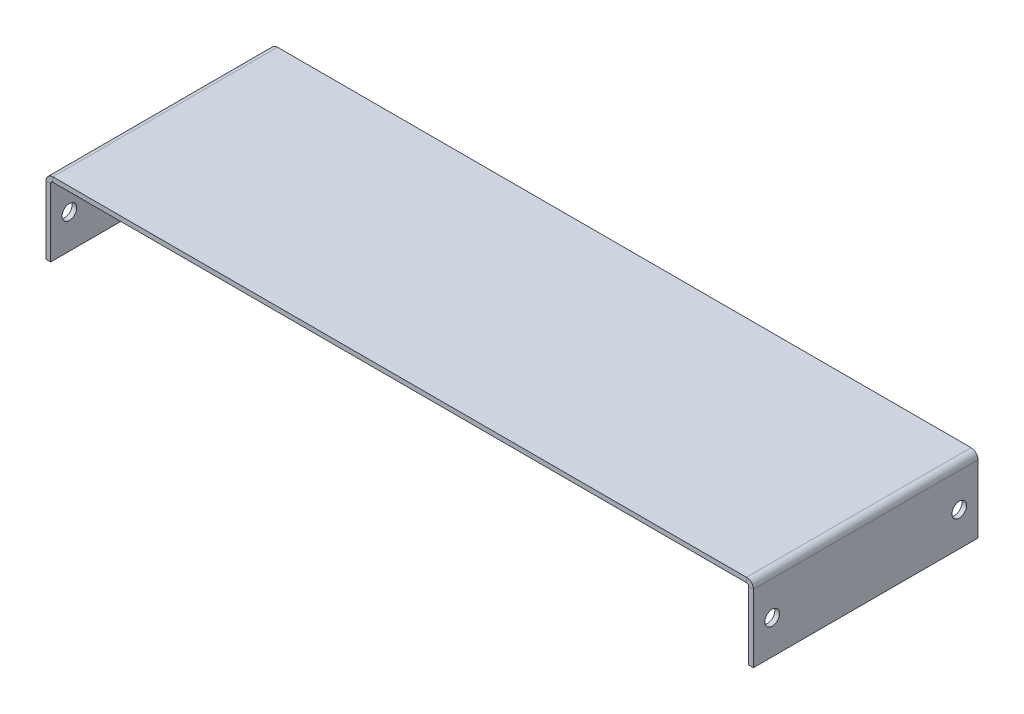
ISO-10303-21;
HEADER;
FILE_DESCRIPTION(('STEP AP214'),'2;1');
FILE_NAME('part.step','',(''),(''),'','','');
FILE_SCHEMA(('AUTOMOTIVE_DESIGN { 1 0 10303 214 1 1 1 1 }'));
ENDSEC;
DATA;
#1=APPLICATION_CONTEXT('core data for automotive mechanical design processes');
#2=APPLICATION_PROTOCOL_DEFINITION('international standard','automotive_design',2000,#1);
#3=PRODUCT_CONTEXT('',#1,'mechanical');
#4=PRODUCT('Part','Part','',(#3));
#5=PRODUCT_RELATED_PRODUCT_CATEGORY('part','',(#4));
#6=PRODUCT_DEFINITION_FORMATION('','',#4);
#7=PRODUCT_DEFINITION_CONTEXT('part definition',#1,'design');
#8=PRODUCT_DEFINITION('design','',#6,#7);
#9=PRODUCT_DEFINITION_SHAPE('','',#8);
#10=(LENGTH_UNIT() NAMED_UNIT(*) SI_UNIT(.MILLI.,.METRE.));
#11=(NAMED_UNIT(*) PLANE_ANGLE_UNIT() SI_UNIT($,.RADIAN.));
#12=(NAMED_UNIT(*) SI_UNIT($,.STERADIAN.) SOLID_ANGLE_UNIT());
#13=UNCERTAINTY_MEASURE_WITH_UNIT(LENGTH_MEASURE(1.E-05),#10,'distance_accuracy_value','');
#14=(GEOMETRIC_REPRESENTATION_CONTEXT(3) GLOBAL_UNCERTAINTY_ASSIGNED_CONTEXT((#13)) GLOBAL_UNIT_ASSIGNED_CONTEXT((#10,
#11,#12)) REPRESENTATION_CONTEXT('',''));
#15=CARTESIAN_POINT('',(0.,0.,0.));
#16=DIRECTION('',(0.,0.,1.));
#17=DIRECTION('',(1.,0.,0.));
#18=AXIS2_PLACEMENT_3D('',#15,#16,#17);
#19=CARTESIAN_POINT('',(-117.6655,25.4,38.1));
#20=DIRECTION('',(0.,0.,1.));
#21=DIRECTION('',(1.,0.,0.));
#22=AXIS2_PLACEMENT_3D('',#19,#20,#21);
#23=PLANE('',#22);
#24=DIRECTION('',(0.,-1.,0.));
#25=VECTOR('',#24,1.);
#26=CARTESIAN_POINT('',(-117.6655,25.4,38.1));
#27=LINE('',#26,#25);
#28=CARTESIAN_POINT('',(-117.6655,25.4,38.1));
#29=VERTEX_POINT('',#28);
#30=CARTESIAN_POINT('',(-117.6655,23.8125,38.1));
#31=VERTEX_POINT('',#30);
#32=EDGE_CURVE('E11',#29,#31,#27,.T.);
#33=ORIENTED_EDGE('',*,*,#32,.F.);
#34=CARTESIAN_POINT('',(-117.6655,23.0505,38.1));
#35=DIRECTION('',(0.,0.,1.));
#36=DIRECTION('',(1.,0.,0.));
#37=AXIS2_PLACEMENT_3D('',#34,#35,#36);
#38=CIRCLE('',#37,2.3495);
#39=CARTESIAN_POINT('',(-120.015,23.0505,38.1));
#40=VERTEX_POINT('',#39);
#41=EDGE_CURVE('E330',#40,#29,#38,.F.);
#42=ORIENTED_EDGE('',*,*,#41,.F.);
#43=DIRECTION('',(-1.,0.,0.));
#44=VECTOR('',#43,1.);
#45=CARTESIAN_POINT('',(-118.4275,23.0505,38.1));
#46=LINE('',#45,#44);
#47=CARTESIAN_POINT('',(-118.4275,23.0505,38.1));
#48=VERTEX_POINT('',#47);
#49=EDGE_CURVE('E57',#48,#40,#46,.T.);
#50=ORIENTED_EDGE('',*,*,#49,.F.);
#51=CARTESIAN_POINT('',(-117.6655,23.0505,38.1));
#52=DIRECTION('',(0.,0.,1.));
#53=DIRECTION('',(1.,0.,0.));
#54=AXIS2_PLACEMENT_3D('',#51,#52,#53);
#55=CIRCLE('',#54,0.762);
#56=EDGE_CURVE('E159',#48,#31,#55,.F.);
#57=ORIENTED_EDGE('',*,*,#56,.T.);
#58=EDGE_LOOP('',(#33,#42,#50,#57));
#59=FACE_BOUND('',#58,.T.);
#60=ADVANCED_FACE('F47',(#59),#23,.T.);
#61=CARTESIAN_POINT('',(-118.4275,23.0505,38.1));
#62=DIRECTION('',(0.,0.,1.));
#63=DIRECTION('',(1.,0.,0.));
#64=AXIS2_PLACEMENT_3D('',#61,#62,#63);
#65=PLANE('',#64);
#66=DIRECTION('',(1.,0.,0.));
#67=VECTOR('',#66,1.);
#68=CARTESIAN_POINT('',(-120.015,25.4,38.1));
#69=LINE('',#68,#67);
#70=CARTESIAN_POINT('',(117.6655,25.4,38.1));
#71=VERTEX_POINT('',#70);
#72=EDGE_CURVE('E153',#29,#71,#69,.T.);
#73=ORIENTED_EDGE('',*,*,#72,.F.);
#74=ORIENTED_EDGE('',*,*,#32,.T.);
#75=DIRECTION('',(1.,0.,0.));
#76=VECTOR('',#75,1.);
#77=CARTESIAN_POINT('',(-120.015,23.8125,38.1));
#78=LINE('',#77,#76);
#79=CARTESIAN_POINT('',(117.6655,23.8125,38.1));
#80=VERTEX_POINT('',#79);
#81=EDGE_CURVE('E150',#31,#80,#78,.T.);
#82=ORIENTED_EDGE('',*,*,#81,.T.);
#83=DIRECTION('',(0.,1.,0.));
#84=VECTOR('',#83,1.);
#85=CARTESIAN_POINT('',(117.6655,23.8125,38.1));
#86=LINE('',#85,#84);
#87=EDGE_CURVE('E271',#80,#71,#86,.T.);
#88=ORIENTED_EDGE('',*,*,#87,.T.);
#89=EDGE_LOOP('',(#73,#74,#82,#88));
#90=FACE_BOUND('',#89,.T.);
#91=ADVANCED_FACE('F148',(#90),#65,.T.);
#92=CARTESIAN_POINT('',(-120.015,23.0505,-38.1));
#93=DIRECTION('',(0.,0.,-1.));
#94=DIRECTION('',(-1.,0.,0.));
#95=AXIS2_PLACEMENT_3D('',#92,#93,#94);
#96=PLANE('',#95);
#97=DIRECTION('',(1.,0.,0.));
#98=VECTOR('',#97,1.);
#99=CARTESIAN_POINT('',(-120.015,23.0505,-38.1));
#100=LINE('',#99,#98);
#101=CARTESIAN_POINT('',(-120.015,23.0505,-38.1));
#102=VERTEX_POINT('',#101);
#103=CARTESIAN_POINT('',(-118.4275,23.0505,-38.1));
#104=VERTEX_POINT('',#103);
#105=EDGE_CURVE('E279',#102,#104,#100,.T.);
#106=ORIENTED_EDGE('',*,*,#105,.F.);
#107=CARTESIAN_POINT('',(-117.6655,23.0505,-38.1));
#108=DIRECTION('',(0.,0.,1.));
#109=DIRECTION('',(1.,0.,0.));
#110=AXIS2_PLACEMENT_3D('',#107,#108,#109);
#111=CIRCLE('',#110,2.3495);
#112=CARTESIAN_POINT('',(-117.6655,25.4,-38.1));
#113=VERTEX_POINT('',#112);
#114=EDGE_CURVE('E208',#102,#113,#111,.F.);
#115=ORIENTED_EDGE('',*,*,#114,.T.);
#116=DIRECTION('',(0.,1.,0.));
#117=VECTOR('',#116,1.);
#118=CARTESIAN_POINT('',(-117.6655,23.8125,-38.1));
#119=LINE('',#118,#117);
#120=CARTESIAN_POINT('',(-117.6655,23.8125,-38.1));
#121=VERTEX_POINT('',#120);
#122=EDGE_CURVE('E276',#121,#113,#119,.T.);
#123=ORIENTED_EDGE('',*,*,#122,.F.);
#124=CARTESIAN_POINT('',(-117.6655,23.0505,-38.1));
#125=DIRECTION('',(0.,0.,1.));
#126=DIRECTION('',(1.,0.,0.));
#127=AXIS2_PLACEMENT_3D('',#124,#125,#126);
#128=CIRCLE('',#127,0.762);
#129=EDGE_CURVE('E172',#104,#121,#128,.F.);
#130=ORIENTED_EDGE('',*,*,#129,.F.);
#131=EDGE_LOOP('',(#106,#115,#123,#130));
#132=FACE_BOUND('',#131,.T.);
#133=ADVANCED_FACE('F352',(#132),#96,.T.);
#134=CARTESIAN_POINT('',(-117.6655,23.8125,-38.1));
#135=DIRECTION('',(0.,0.,-1.));
#136=DIRECTION('',(-1.,0.,0.));
#137=AXIS2_PLACEMENT_3D('',#134,#135,#136);
#138=PLANE('',#137);
#139=DIRECTION('',(0.,1.,0.));
#140=VECTOR('',#139,1.);
#141=CARTESIAN_POINT('',(-120.015,0.,-38.1));
#142=LINE('',#141,#140);
#143=CARTESIAN_POINT('',(-120.015,0.,-38.1));
#144=VERTEX_POINT('',#143);
#145=EDGE_CURVE('E212',#144,#102,#142,.T.);
#146=ORIENTED_EDGE('',*,*,#145,.T.);
#147=ORIENTED_EDGE('',*,*,#105,.T.);
#148=DIRECTION('',(0.,1.,0.));
#149=VECTOR('',#148,1.);
#150=CARTESIAN_POINT('',(-118.4275,0.,-38.1));
#151=LINE('',#150,#149);
#152=CARTESIAN_POINT('',(-118.4275,0.,-38.1));
#153=VERTEX_POINT('',#152);
#154=EDGE_CURVE('E220',#153,#104,#151,.T.);
#155=ORIENTED_EDGE('',*,*,#154,.F.);
#156=DIRECTION('',(-1.,0.,0.));
#157=VECTOR('',#156,1.);
#158=CARTESIAN_POINT('',(-118.4275,0.,-38.1));
#159=LINE('',#158,#157);
#160=EDGE_CURVE('E216',#153,#144,#159,.T.);
#161=ORIENTED_EDGE('',*,*,#160,.T.);
#162=EDGE_LOOP('',(#146,#147,#155,#161));
#163=FACE_BOUND('',#162,.T.);
#164=ADVANCED_FACE('F400',(#163),#138,.T.);
#165=CARTESIAN_POINT('',(120.015,23.0505,38.1));
#166=DIRECTION('',(0.,0.,1.));
#167=DIRECTION('',(1.,0.,0.));
#168=AXIS2_PLACEMENT_3D('',#165,#166,#167);
#169=PLANE('',#168);
#170=DIRECTION('',(-1.,0.,0.));
#171=VECTOR('',#170,1.);
#172=CARTESIAN_POINT('',(120.015,23.0505,38.1));
#173=LINE('',#172,#171);
#174=CARTESIAN_POINT('',(120.015,23.0505,38.1));
#175=VERTEX_POINT('',#174);
#176=CARTESIAN_POINT('',(118.4275,23.0505,38.1));
#177=VERTEX_POINT('',#176);
#178=EDGE_CURVE('E66',#175,#177,#173,.T.);
#179=ORIENTED_EDGE('',*,*,#178,.F.);
#180=CARTESIAN_POINT('',(117.6655,23.0505,38.1));
#181=DIRECTION('',(0.,0.,1.));
#182=DIRECTION('',(1.,0.,0.));
#183=AXIS2_PLACEMENT_3D('',#180,#181,#182);
#184=CIRCLE('',#183,2.3495);
#185=EDGE_CURVE('E324',#71,#175,#184,.F.);
#186=ORIENTED_EDGE('',*,*,#185,.F.);
#187=ORIENTED_EDGE('',*,*,#87,.F.);
#188=CARTESIAN_POINT('',(117.6655,23.0505,38.1));
#189=DIRECTION('',(0.,0.,1.));
#190=DIRECTION('',(1.,0.,0.));
#191=AXIS2_PLACEMENT_3D('',#188,#189,#190);
#192=CIRCLE('',#191,0.762);
#193=EDGE_CURVE('E182',#80,#177,#192,.F.);
#194=ORIENTED_EDGE('',*,*,#193,.T.);
#195=EDGE_LOOP('',(#179,#186,#187,#194));
#196=FACE_BOUND('',#195,.T.);
#197=ADVANCED_FACE('F405',(#196),#169,.T.);
#198=CARTESIAN_POINT('',(117.6655,23.8125,38.1));
#199=DIRECTION('',(0.,0.,1.));
#200=DIRECTION('',(1.,0.,0.));
#201=AXIS2_PLACEMENT_3D('',#198,#199,#200);
#202=PLANE('',#201);
#203=DIRECTION('',(0.,-1.,0.));
#204=VECTOR('',#203,1.);
#205=CARTESIAN_POINT('',(120.015,25.4,38.1));
#206=LINE('',#205,#204);
#207=CARTESIAN_POINT('',(120.015,0.,38.1));
#208=VERTEX_POINT('',#207);
#209=EDGE_CURVE('E320',#175,#208,#206,.T.);
#210=ORIENTED_EDGE('',*,*,#209,.F.);
#211=ORIENTED_EDGE('',*,*,#178,.T.);
#212=DIRECTION('',(0.,1.,0.));
#213=VECTOR('',#212,1.);
#214=CARTESIAN_POINT('',(118.4275,25.4,38.1));
#215=LINE('',#214,#213);
#216=CARTESIAN_POINT('',(118.4275,0.,38.1));
#217=VERTEX_POINT('',#216);
#218=EDGE_CURVE('E120',#177,#217,#215,.F.);
#219=ORIENTED_EDGE('',*,*,#218,.T.);
#220=DIRECTION('',(-1.,0.,0.));
#221=VECTOR('',#220,1.);
#222=CARTESIAN_POINT('',(120.015,0.,38.1));
#223=LINE('',#222,#221);
#224=EDGE_CURVE('E316',#208,#217,#223,.T.);
#225=ORIENTED_EDGE('',*,*,#224,.F.);
#226=EDGE_LOOP('',(#210,#211,#219,#225));
#227=FACE_BOUND('',#226,.T.);
#228=ADVANCED_FACE('F379',(#227),#202,.T.);
#229=CARTESIAN_POINT('',(117.6655,25.4,-38.1));
#230=DIRECTION('',(0.,0.,-1.));
#231=DIRECTION('',(-1.,0.,0.));
#232=AXIS2_PLACEMENT_3D('',#229,#230,#231);
#233=PLANE('',#232);
#234=DIRECTION('',(0.,-1.,0.));
#235=VECTOR('',#234,1.);
#236=CARTESIAN_POINT('',(117.6655,25.4,-38.1));
#237=LINE('',#236,#235);
#238=CARTESIAN_POINT('',(117.6655,25.4,-38.1));
#239=VERTEX_POINT('',#238);
#240=CARTESIAN_POINT('',(117.6655,23.8125,-38.1));
#241=VERTEX_POINT('',#240);
#242=EDGE_CURVE('E107',#239,#241,#237,.T.);
#243=ORIENTED_EDGE('',*,*,#242,.F.);
#244=CARTESIAN_POINT('',(117.6655,23.0505,-38.1));
#245=DIRECTION('',(0.,0.,1.));
#246=DIRECTION('',(1.,0.,0.));
#247=AXIS2_PLACEMENT_3D('',#244,#245,#246);
#248=CIRCLE('',#247,2.3495);
#249=CARTESIAN_POINT('',(120.015,23.0505,-38.1));
#250=VERTEX_POINT('',#249);
#251=EDGE_CURVE('E202',#239,#250,#248,.F.);
#252=ORIENTED_EDGE('',*,*,#251,.T.);
#253=DIRECTION('',(1.,0.,0.));
#254=VECTOR('',#253,1.);
#255=CARTESIAN_POINT('',(118.4275,23.0505,-38.1));
#256=LINE('',#255,#254);
#257=CARTESIAN_POINT('',(118.4275,23.0505,-38.1));
#258=VERTEX_POINT('',#257);
#259=EDGE_CURVE('E114',#258,#250,#256,.T.);
#260=ORIENTED_EDGE('',*,*,#259,.F.);
#261=CARTESIAN_POINT('',(117.6655,23.0505,-38.1));
#262=DIRECTION('',(0.,0.,1.));
#263=DIRECTION('',(1.,0.,0.));
#264=AXIS2_PLACEMENT_3D('',#261,#262,#263);
#265=CIRCLE('',#264,0.762);
#266=EDGE_CURVE('E229',#241,#258,#265,.F.);
#267=ORIENTED_EDGE('',*,*,#266,.F.);
#268=EDGE_LOOP('',(#243,#252,#260,#267));
#269=FACE_BOUND('',#268,.T.);
#270=ADVANCED_FACE('F367',(#269),#233,.T.);
#271=CARTESIAN_POINT('',(118.4275,23.0505,-38.1));
#272=DIRECTION('',(0.,0.,-1.));
#273=DIRECTION('',(-1.,0.,0.));
#274=AXIS2_PLACEMENT_3D('',#271,#272,#273);
#275=PLANE('',#274);
#276=DIRECTION('',(1.,0.,0.));
#277=VECTOR('',#276,1.);
#278=CARTESIAN_POINT('',(-120.015,25.4,-38.1));
#279=LINE('',#278,#277);
#280=EDGE_CURVE('E205',#113,#239,#279,.T.);
#281=ORIENTED_EDGE('',*,*,#280,.T.);
#282=ORIENTED_EDGE('',*,*,#242,.T.);
#283=DIRECTION('',(1.,0.,0.));
#284=VECTOR('',#283,1.);
#285=CARTESIAN_POINT('',(-120.015,23.8125,-38.1));
#286=LINE('',#285,#284);
#287=EDGE_CURVE('E226',#121,#241,#286,.T.);
#288=ORIENTED_EDGE('',*,*,#287,.F.);
#289=ORIENTED_EDGE('',*,*,#122,.T.);
#290=EDGE_LOOP('',(#281,#282,#288,#289));
#291=FACE_BOUND('',#290,.T.);
#292=ADVANCED_FACE('F354',(#291),#275,.T.);
#293=CARTESIAN_POINT('',(118.4275,25.4,38.1));
#294=DIRECTION('',(1.,0.,0.));
#295=DIRECTION('',(0.,0.,-1.));
#296=AXIS2_PLACEMENT_3D('',#293,#294,#295);
#297=PLANE('',#296);
#298=CARTESIAN_POINT('',(118.4275,11.52525,-31.75));
#299=DIRECTION('',(1.,0.,0.));
#300=DIRECTION('',(0.,0.,-1.));
#301=AXIS2_PLACEMENT_3D('',#298,#299,#300);
#302=CIRCLE('',#301,2.4892);
#303=CARTESIAN_POINT('',(118.4275,11.52525,-34.2392));
#304=VERTEX_POINT('',#303);
#305=EDGE_CURVE('E194',#304,#304,#302,.T.);
#306=ORIENTED_EDGE('',*,*,#305,.T.);
#307=EDGE_LOOP('',(#306));
#308=FACE_BOUND('',#307,.T.);
#309=CARTESIAN_POINT('',(118.4275,11.52525,31.75));
#310=DIRECTION('',(1.,0.,0.));
#311=DIRECTION('',(0.,0.,-1.));
#312=AXIS2_PLACEMENT_3D('',#309,#310,#311);
#313=CIRCLE('',#312,2.4892);
#314=CARTESIAN_POINT('',(118.4275,11.52525,29.2608));
#315=VERTEX_POINT('',#314);
#316=EDGE_CURVE('E286',#315,#315,#313,.T.);
#317=ORIENTED_EDGE('',*,*,#316,.T.);
#318=EDGE_LOOP('',(#317));
#319=FACE_BOUND('',#318,.T.);
#320=DIRECTION('',(0.,1.,0.));
#321=VECTOR('',#320,1.);
#322=CARTESIAN_POINT('',(118.4275,25.4,-38.1));
#323=LINE('',#322,#321);
#324=CARTESIAN_POINT('',(118.4275,0.,-38.1));
#325=VERTEX_POINT('',#324);
#326=EDGE_CURVE('E189',#258,#325,#323,.F.);
#327=ORIENTED_EDGE('',*,*,#326,.T.);
#328=DIRECTION('',(0.,0.,-1.));
#329=VECTOR('',#328,1.);
#330=CARTESIAN_POINT('',(118.4275,0.,38.1));
#331=LINE('',#330,#329);
#332=EDGE_CURVE('E264',#217,#325,#331,.T.);
#333=ORIENTED_EDGE('',*,*,#332,.F.);
#334=ORIENTED_EDGE('',*,*,#218,.F.);
#335=DIRECTION('',(0.,0.,-1.));
#336=VECTOR('',#335,1.);
#337=CARTESIAN_POINT('',(118.4275,23.0505,38.1));
#338=LINE('',#337,#336);
#339=EDGE_CURVE('E185',#177,#258,#338,.T.);
#340=ORIENTED_EDGE('',*,*,#339,.T.);
#341=EDGE_LOOP('',(#327,#333,#334,#340));
#342=FACE_BOUND('',#341,.T.);
#343=ADVANCED_FACE('F373',(#308,#319,#342),#297,.F.);
#344=CARTESIAN_POINT('',(120.015,0.,38.1));
#345=DIRECTION('',(0.,-1.,0.));
#346=DIRECTION('',(0.,0.,-1.));
#347=AXIS2_PLACEMENT_3D('',#344,#345,#346);
#348=PLANE('',#347);
#349=DIRECTION('',(-1.,0.,0.));
#350=VECTOR('',#349,1.);
#351=CARTESIAN_POINT('',(120.015,0.,-38.1));
#352=LINE('',#351,#350);
#353=CARTESIAN_POINT('',(120.015,0.,-38.1));
#354=VERTEX_POINT('',#353);
#355=EDGE_CURVE('E193',#354,#325,#352,.T.);
#356=ORIENTED_EDGE('',*,*,#355,.F.);
#357=DIRECTION('',(0.,0.,-1.));
#358=VECTOR('',#357,1.);
#359=CARTESIAN_POINT('',(120.015,0.,38.1));
#360=LINE('',#359,#358);
#361=EDGE_CURVE('E261',#208,#354,#360,.T.);
#362=ORIENTED_EDGE('',*,*,#361,.F.);
#363=ORIENTED_EDGE('',*,*,#224,.T.);
#364=ORIENTED_EDGE('',*,*,#332,.T.);
#365=EDGE_LOOP('',(#356,#362,#363,#364));
#366=FACE_BOUND('',#365,.T.);
#367=ADVANCED_FACE('F378',(#366),#348,.T.);
#368=CARTESIAN_POINT('',(120.015,25.4,38.1));
#369=DIRECTION('',(1.,0.,0.));
#370=DIRECTION('',(0.,0.,-1.));
#371=AXIS2_PLACEMENT_3D('',#368,#369,#370);
#372=PLANE('',#371);
#373=CARTESIAN_POINT('',(120.015,11.52525,-31.75));
#374=DIRECTION('',(-1.,0.,0.));
#375=DIRECTION('',(0.,0.,1.));
#376=AXIS2_PLACEMENT_3D('',#373,#374,#375);
#377=CIRCLE('',#376,2.4892);
#378=CARTESIAN_POINT('',(120.015,11.52525,-29.2608));
#379=VERTEX_POINT('',#378);
#380=EDGE_CURVE('E287',#379,#379,#377,.T.);
#381=ORIENTED_EDGE('',*,*,#380,.T.);
#382=EDGE_LOOP('',(#381));
#383=FACE_BOUND('',#382,.T.);
#384=CARTESIAN_POINT('',(120.015,11.52525,31.75));
#385=DIRECTION('',(-1.,0.,0.));
#386=DIRECTION('',(0.,0.,1.));
#387=AXIS2_PLACEMENT_3D('',#384,#385,#386);
#388=CIRCLE('',#387,2.4892);
#389=CARTESIAN_POINT('',(120.015,11.52525,34.2392));
#390=VERTEX_POINT('',#389);
#391=EDGE_CURVE('E307',#390,#390,#388,.T.);
#392=ORIENTED_EDGE('',*,*,#391,.T.);
#393=EDGE_LOOP('',(#392));
#394=FACE_BOUND('',#393,.T.);
#395=DIRECTION('',(0.,-1.,0.));
#396=VECTOR('',#395,1.);
#397=CARTESIAN_POINT('',(120.015,25.4,-38.1));
#398=LINE('',#397,#396);
#399=EDGE_CURVE('E198',#250,#354,#398,.T.);
#400=ORIENTED_EDGE('',*,*,#399,.F.);
#401=DIRECTION('',(0.,0.,-1.));
#402=VECTOR('',#401,1.);
#403=CARTESIAN_POINT('',(120.015,23.0505,38.1));
#404=LINE('',#403,#402);
#405=EDGE_CURVE('E257',#175,#250,#404,.T.);
#406=ORIENTED_EDGE('',*,*,#405,.F.);
#407=ORIENTED_EDGE('',*,*,#209,.T.);
#408=ORIENTED_EDGE('',*,*,#361,.T.);
#409=EDGE_LOOP('',(#400,#406,#407,#408));
#410=FACE_BOUND('',#409,.T.);
#411=ADVANCED_FACE('F381',(#383,#394,#410),#372,.T.);
#412=CARTESIAN_POINT('',(117.6655,23.0505,38.1));
#413=DIRECTION('',(0.,0.,-1.));
#414=DIRECTION('',(-1.,0.,0.));
#415=AXIS2_PLACEMENT_3D('',#412,#413,#414);
#416=CYLINDRICAL_SURFACE('',#415,2.3495);
#417=ORIENTED_EDGE('',*,*,#251,.F.);
#418=DIRECTION('',(0.,0.,-1.));
#419=VECTOR('',#418,1.);
#420=CARTESIAN_POINT('',(117.6655,25.4,38.1));
#421=LINE('',#420,#419);
#422=EDGE_CURVE('E253',#71,#239,#421,.T.);
#423=ORIENTED_EDGE('',*,*,#422,.F.);
#424=ORIENTED_EDGE('',*,*,#185,.T.);
#425=ORIENTED_EDGE('',*,*,#405,.T.);
#426=EDGE_LOOP('',(#417,#423,#424,#425));
#427=FACE_BOUND('',#426,.T.);
#428=ADVANCED_FACE('F364',(#427),#416,.T.);
#429=CARTESIAN_POINT('',(-120.015,25.4,38.1));
#430=DIRECTION('',(0.,1.,0.));
#431=DIRECTION('',(0.,0.,1.));
#432=AXIS2_PLACEMENT_3D('',#429,#430,#431);
#433=PLANE('',#432);
#434=ORIENTED_EDGE('',*,*,#280,.F.);
#435=DIRECTION('',(0.,0.,-1.));
#436=VECTOR('',#435,1.);
#437=CARTESIAN_POINT('',(-117.6655,25.4,38.1));
#438=LINE('',#437,#436);
#439=EDGE_CURVE('E249',#29,#113,#438,.T.);
#440=ORIENTED_EDGE('',*,*,#439,.F.);
#441=ORIENTED_EDGE('',*,*,#72,.T.);
#442=ORIENTED_EDGE('',*,*,#422,.T.);
#443=EDGE_LOOP('',(#434,#440,#441,#442));
#444=FACE_BOUND('',#443,.T.);
#445=ADVANCED_FACE('F359',(#444),#433,.T.);
#446=CARTESIAN_POINT('',(-117.6655,23.0505,38.1));
#447=DIRECTION('',(0.,0.,-1.));
#448=DIRECTION('',(-1.,0.,0.));
#449=AXIS2_PLACEMENT_3D('',#446,#447,#448);
#450=CYLINDRICAL_SURFACE('',#449,2.3495);
#451=ORIENTED_EDGE('',*,*,#114,.F.);
#452=DIRECTION('',(0.,0.,-1.));
#453=VECTOR('',#452,1.);
#454=CARTESIAN_POINT('',(-120.015,23.0505,38.1));
#455=LINE('',#454,#453);
#456=EDGE_CURVE('E245',#40,#102,#455,.T.);
#457=ORIENTED_EDGE('',*,*,#456,.F.);
#458=ORIENTED_EDGE('',*,*,#41,.T.);
#459=ORIENTED_EDGE('',*,*,#439,.T.);
#460=EDGE_LOOP('',(#451,#457,#458,#459));
#461=FACE_BOUND('',#460,.T.);
#462=ADVANCED_FACE('F357',(#461),#450,.T.);
#463=CARTESIAN_POINT('',(-120.015,0.,38.1));
#464=DIRECTION('',(-1.,0.,0.));
#465=DIRECTION('',(0.,0.,1.));
#466=AXIS2_PLACEMENT_3D('',#463,#464,#465);
#467=PLANE('',#466);
#468=CARTESIAN_POINT('',(-120.015,11.52525,-31.75));
#469=DIRECTION('',(-1.,0.,0.));
#470=DIRECTION('',(0.,0.,1.));
#471=AXIS2_PLACEMENT_3D('',#468,#469,#470);
#472=CIRCLE('',#471,2.4892);
#473=CARTESIAN_POINT('',(-120.015,11.52525,-29.2608));
#474=VERTEX_POINT('',#473);
#475=EDGE_CURVE('E295',#474,#474,#472,.T.);
#476=ORIENTED_EDGE('',*,*,#475,.F.);
#477=EDGE_LOOP('',(#476));
#478=FACE_BOUND('',#477,.T.);
#479=CARTESIAN_POINT('',(-120.015,11.52525,31.75));
#480=DIRECTION('',(-1.,0.,0.));
#481=DIRECTION('',(0.,0.,1.));
#482=AXIS2_PLACEMENT_3D('',#479,#480,#481);
#483=CIRCLE('',#482,2.4892);
#484=CARTESIAN_POINT('',(-120.015,11.52525,34.2392));
#485=VERTEX_POINT('',#484);
#486=EDGE_CURVE('E301',#485,#485,#483,.T.);
#487=ORIENTED_EDGE('',*,*,#486,.F.);
#488=EDGE_LOOP('',(#487));
#489=FACE_BOUND('',#488,.T.);
#490=ORIENTED_EDGE('',*,*,#145,.F.);
#491=DIRECTION('',(0.,0.,-1.));
#492=VECTOR('',#491,1.);
#493=CARTESIAN_POINT('',(-120.015,0.,38.1));
#494=LINE('',#493,#492);
#495=CARTESIAN_POINT('',(-120.015,0.,38.1));
#496=VERTEX_POINT('',#495);
#497=EDGE_CURVE('E242',#496,#144,#494,.T.);
#498=ORIENTED_EDGE('',*,*,#497,.F.);
#499=DIRECTION('',(0.,1.,0.));
#500=VECTOR('',#499,1.);
#501=CARTESIAN_POINT('',(-120.015,0.,38.1));
#502=LINE('',#501,#500);
#503=EDGE_CURVE('E333',#496,#40,#502,.T.);
#504=ORIENTED_EDGE('',*,*,#503,.T.);
#505=ORIENTED_EDGE('',*,*,#456,.T.);
#506=EDGE_LOOP('',(#490,#498,#504,#505));
#507=FACE_BOUND('',#506,.T.);
#508=ADVANCED_FACE('F449',(#478,#489,#507),#467,.T.);
#509=CARTESIAN_POINT('',(-118.4275,0.,38.1));
#510=DIRECTION('',(0.,-1.,0.));
#511=DIRECTION('',(0.,0.,-1.));
#512=AXIS2_PLACEMENT_3D('',#509,#510,#511);
#513=PLANE('',#512);
#514=ORIENTED_EDGE('',*,*,#160,.F.);
#515=DIRECTION('',(0.,0.,-1.));
#516=VECTOR('',#515,1.);
#517=CARTESIAN_POINT('',(-118.4275,0.,38.1));
#518=LINE('',#517,#516);
#519=CARTESIAN_POINT('',(-118.4275,0.,38.1));
#520=VERTEX_POINT('',#519);
#521=EDGE_CURVE('E239',#520,#153,#518,.T.);
#522=ORIENTED_EDGE('',*,*,#521,.F.);
#523=DIRECTION('',(-1.,0.,0.));
#524=VECTOR('',#523,1.);
#525=CARTESIAN_POINT('',(-118.4275,0.,38.1));
#526=LINE('',#525,#524);
#527=EDGE_CURVE('E337',#520,#496,#526,.T.);
#528=ORIENTED_EDGE('',*,*,#527,.T.);
#529=ORIENTED_EDGE('',*,*,#497,.T.);
#530=EDGE_LOOP('',(#514,#522,#528,#529));
#531=FACE_BOUND('',#530,.T.);
#532=ADVANCED_FACE('F451',(#531),#513,.T.);
#533=CARTESIAN_POINT('',(-118.4275,0.,38.1));
#534=DIRECTION('',(-1.,0.,0.));
#535=DIRECTION('',(0.,0.,1.));
#536=AXIS2_PLACEMENT_3D('',#533,#534,#535);
#537=PLANE('',#536);
#538=CARTESIAN_POINT('',(-118.4275,11.52525,-31.75));
#539=DIRECTION('',(-1.,0.,0.));
#540=DIRECTION('',(0.,0.,1.));
#541=AXIS2_PLACEMENT_3D('',#538,#539,#540);
#542=CIRCLE('',#541,2.4892);
#543=CARTESIAN_POINT('',(-118.4275,11.52525,-29.2608));
#544=VERTEX_POINT('',#543);
#545=EDGE_CURVE('E50',#544,#544,#542,.T.);
#546=ORIENTED_EDGE('',*,*,#545,.T.);
#547=EDGE_LOOP('',(#546));
#548=FACE_BOUND('',#547,.T.);
#549=CARTESIAN_POINT('',(-118.4275,11.52525,31.75));
#550=DIRECTION('',(-1.,0.,0.));
#551=DIRECTION('',(0.,0.,1.));
#552=AXIS2_PLACEMENT_3D('',#549,#550,#551);
#553=CIRCLE('',#552,2.4892);
#554=CARTESIAN_POINT('',(-118.4275,11.52525,34.2392));
#555=VERTEX_POINT('',#554);
#556=EDGE_CURVE('E283',#555,#555,#553,.T.);
#557=ORIENTED_EDGE('',*,*,#556,.T.);
#558=EDGE_LOOP('',(#557));
#559=FACE_BOUND('',#558,.T.);
#560=ORIENTED_EDGE('',*,*,#154,.T.);
#561=DIRECTION('',(0.,0.,-1.));
#562=VECTOR('',#561,1.);
#563=CARTESIAN_POINT('',(-118.4275,23.0505,38.1));
#564=LINE('',#563,#562);
#565=EDGE_CURVE('E175',#48,#104,#564,.T.);
#566=ORIENTED_EDGE('',*,*,#565,.F.);
#567=DIRECTION('',(0.,1.,0.));
#568=VECTOR('',#567,1.);
#569=CARTESIAN_POINT('',(-118.4275,0.,38.1));
#570=LINE('',#569,#568);
#571=EDGE_CURVE('E165',#520,#48,#570,.T.);
#572=ORIENTED_EDGE('',*,*,#571,.F.);
#573=ORIENTED_EDGE('',*,*,#521,.T.);
#574=EDGE_LOOP('',(#560,#566,#572,#573));
#575=FACE_BOUND('',#574,.T.);
#576=ADVANCED_FACE('F349',(#548,#559,#575),#537,.F.);
#577=CARTESIAN_POINT('',(-117.6655,23.0505,38.1));
#578=DIRECTION('',(0.,0.,-1.));
#579=DIRECTION('',(-1.,0.,0.));
#580=AXIS2_PLACEMENT_3D('',#577,#578,#579);
#581=CYLINDRICAL_SURFACE('',#580,0.762);
#582=ORIENTED_EDGE('',*,*,#129,.T.);
#583=DIRECTION('',(0.,0.,-1.));
#584=VECTOR('',#583,1.);
#585=CARTESIAN_POINT('',(-117.6655,23.8125,38.1));
#586=LINE('',#585,#584);
#587=EDGE_CURVE('E169',#31,#121,#586,.T.);
#588=ORIENTED_EDGE('',*,*,#587,.F.);
#589=ORIENTED_EDGE('',*,*,#56,.F.);
#590=ORIENTED_EDGE('',*,*,#565,.T.);
#591=EDGE_LOOP('',(#582,#588,#589,#590));
#592=FACE_BOUND('',#591,.T.);
#593=ADVANCED_FACE('F170',(#592),#581,.F.);
#594=CARTESIAN_POINT('',(-120.015,23.8125,38.1));
#595=DIRECTION('',(0.,1.,0.));
#596=DIRECTION('',(0.,0.,1.));
#597=AXIS2_PLACEMENT_3D('',#594,#595,#596);
#598=PLANE('',#597);
#599=ORIENTED_EDGE('',*,*,#287,.T.);
#600=DIRECTION('',(0.,0.,-1.));
#601=VECTOR('',#600,1.);
#602=CARTESIAN_POINT('',(117.6655,23.8125,38.1));
#603=LINE('',#602,#601);
#604=EDGE_CURVE('E176',#80,#241,#603,.T.);
#605=ORIENTED_EDGE('',*,*,#604,.F.);
#606=ORIENTED_EDGE('',*,*,#81,.F.);
#607=ORIENTED_EDGE('',*,*,#587,.T.);
#608=EDGE_LOOP('',(#599,#605,#606,#607));
#609=FACE_BOUND('',#608,.T.);
#610=ADVANCED_FACE('F178',(#609),#598,.F.);
#611=CARTESIAN_POINT('',(117.6655,23.0505,38.1));
#612=DIRECTION('',(0.,0.,-1.));
#613=DIRECTION('',(-1.,0.,0.));
#614=AXIS2_PLACEMENT_3D('',#611,#612,#613);
#615=CYLINDRICAL_SURFACE('',#614,0.762);
#616=ORIENTED_EDGE('',*,*,#266,.T.);
#617=ORIENTED_EDGE('',*,*,#339,.F.);
#618=ORIENTED_EDGE('',*,*,#193,.F.);
#619=ORIENTED_EDGE('',*,*,#604,.T.);
#620=EDGE_LOOP('',(#616,#617,#618,#619));
#621=FACE_BOUND('',#620,.T.);
#622=ADVANCED_FACE('F370',(#621),#615,.F.);
#623=CARTESIAN_POINT('',(117.6655,23.0505,38.1));
#624=DIRECTION('',(0.,0.,1.));
#625=DIRECTION('',(1.,0.,0.));
#626=AXIS2_PLACEMENT_3D('',#623,#624,#625);
#627=PLANE('',#626);
#628=ORIENTED_EDGE('',*,*,#571,.T.);
#629=ORIENTED_EDGE('',*,*,#49,.T.);
#630=ORIENTED_EDGE('',*,*,#503,.F.);
#631=ORIENTED_EDGE('',*,*,#527,.F.);
#632=EDGE_LOOP('',(#628,#629,#630,#631));
#633=FACE_BOUND('',#632,.T.);
#634=ADVANCED_FACE('F345',(#633),#627,.T.);
#635=CARTESIAN_POINT('',(117.6655,23.0505,-38.1));
#636=DIRECTION('',(0.,0.,1.));
#637=DIRECTION('',(1.,0.,0.));
#638=AXIS2_PLACEMENT_3D('',#635,#636,#637);
#639=PLANE('',#638);
#640=ORIENTED_EDGE('',*,*,#326,.F.);
#641=ORIENTED_EDGE('',*,*,#259,.T.);
#642=ORIENTED_EDGE('',*,*,#399,.T.);
#643=ORIENTED_EDGE('',*,*,#355,.T.);
#644=EDGE_LOOP('',(#640,#641,#642,#643));
#645=FACE_BOUND('',#644,.T.);
#646=ADVANCED_FACE('F375',(#645),#639,.F.);
#647=CARTESIAN_POINT('',(120.015,11.52525,31.75));
#648=DIRECTION('',(-1.,0.,0.));
#649=DIRECTION('',(0.,0.,1.));
#650=AXIS2_PLACEMENT_3D('',#647,#648,#649);
#651=CYLINDRICAL_SURFACE('',#650,2.4892);
#652=ORIENTED_EDGE('',*,*,#486,.T.);
#653=EDGE_LOOP('',(#652));
#654=FACE_BOUND('',#653,.T.);
#655=ORIENTED_EDGE('',*,*,#556,.F.);
#656=EDGE_LOOP('',(#655));
#657=FACE_BOUND('',#656,.T.);
#658=ADVANCED_FACE('F430',(#654,#657),#651,.F.);
#659=CARTESIAN_POINT('',(120.015,11.52525,-31.75));
#660=DIRECTION('',(-1.,0.,0.));
#661=DIRECTION('',(0.,0.,1.));
#662=AXIS2_PLACEMENT_3D('',#659,#660,#661);
#663=CYLINDRICAL_SURFACE('',#662,2.4892);
#664=ORIENTED_EDGE('',*,*,#475,.T.);
#665=EDGE_LOOP('',(#664));
#666=FACE_BOUND('',#665,.T.);
#667=ORIENTED_EDGE('',*,*,#545,.F.);
#668=EDGE_LOOP('',(#667));
#669=FACE_BOUND('',#668,.T.);
#670=ADVANCED_FACE('F427',(#666,#669),#663,.F.);
#671=ORIENTED_EDGE('',*,*,#391,.F.);
#672=EDGE_LOOP('',(#671));
#673=FACE_BOUND('',#672,.T.);
#674=ORIENTED_EDGE('',*,*,#316,.F.);
#675=EDGE_LOOP('',(#674));
#676=FACE_BOUND('',#675,.T.);
#677=ADVANCED_FACE('F424',(#673,#676),#651,.F.);
#678=ORIENTED_EDGE('',*,*,#380,.F.);
#679=EDGE_LOOP('',(#678));
#680=FACE_BOUND('',#679,.T.);
#681=ORIENTED_EDGE('',*,*,#305,.F.);
#682=EDGE_LOOP('',(#681));
#683=FACE_BOUND('',#682,.T.);
#684=ADVANCED_FACE('F426',(#680,#683),#663,.F.);
#685=CLOSED_SHELL('',(#60,#91,#133,#164,#197,#228,#270,#292,#343,#367,#411,#428,#445,#462,#508,
#532,#576,#593,#610,#622,#634,#646,#658,#670,#677,#684));
#686=MANIFOLD_SOLID_BREP('B2',#685);
#687=ADVANCED_BREP_SHAPE_REPRESENTATION('',(#18,#686),#14);
#688=SHAPE_DEFINITION_REPRESENTATION(#9,#687);
ENDSEC;
END-ISO-10303-21;
